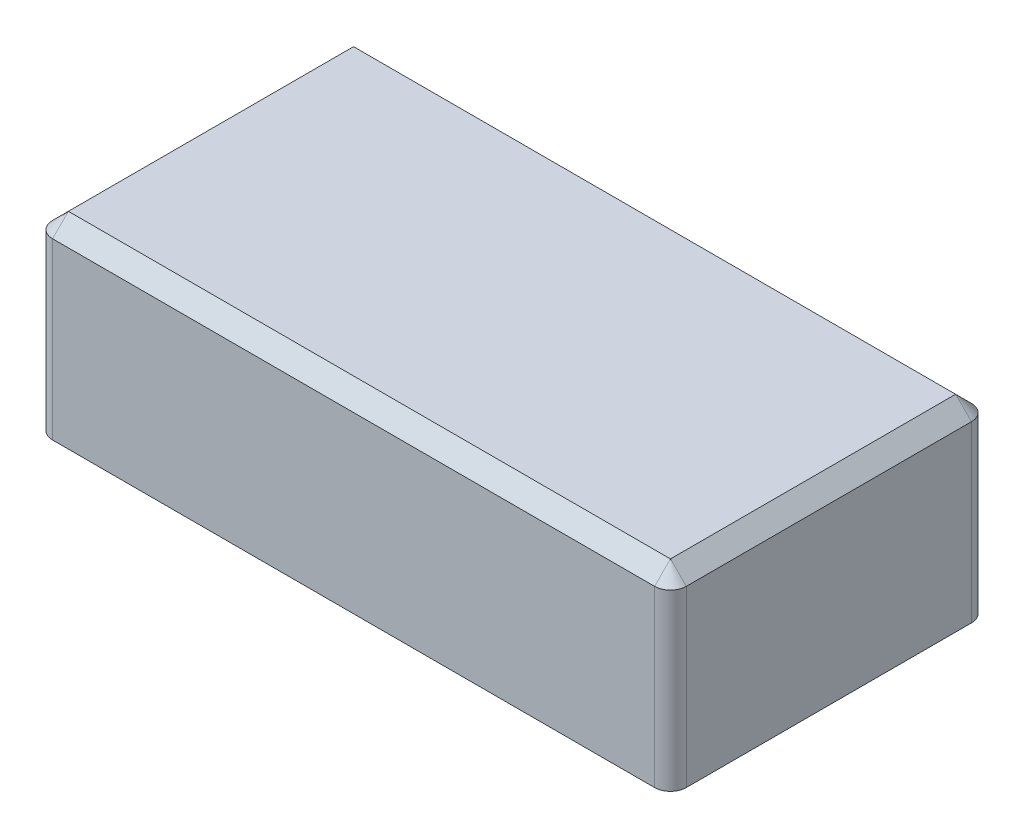
ISO-10303-21;
HEADER;
FILE_DESCRIPTION(('STEP AP214'),'2;1');
FILE_NAME('part.step','',(''),(''),'','','');
FILE_SCHEMA(('AUTOMOTIVE_DESIGN { 1 0 10303 214 1 1 1 1 }'));
ENDSEC;
DATA;
#1=APPLICATION_CONTEXT('core data for automotive mechanical design processes');
#2=APPLICATION_PROTOCOL_DEFINITION('international standard','automotive_design',2000,#1);
#3=PRODUCT_CONTEXT('',#1,'mechanical');
#4=PRODUCT('Part','Part','',(#3));
#5=PRODUCT_RELATED_PRODUCT_CATEGORY('part','',(#4));
#6=PRODUCT_DEFINITION_FORMATION('','',#4);
#7=PRODUCT_DEFINITION_CONTEXT('part definition',#1,'design');
#8=PRODUCT_DEFINITION('design','',#6,#7);
#9=PRODUCT_DEFINITION_SHAPE('','',#8);
#10=(LENGTH_UNIT() NAMED_UNIT(*) SI_UNIT(.MILLI.,.METRE.));
#11=(NAMED_UNIT(*) PLANE_ANGLE_UNIT() SI_UNIT($,.RADIAN.));
#12=(NAMED_UNIT(*) SI_UNIT($,.STERADIAN.) SOLID_ANGLE_UNIT());
#13=UNCERTAINTY_MEASURE_WITH_UNIT(LENGTH_MEASURE(1.E-05),#10,'distance_accuracy_value','');
#14=(GEOMETRIC_REPRESENTATION_CONTEXT(3) GLOBAL_UNCERTAINTY_ASSIGNED_CONTEXT((#13)) GLOBAL_UNIT_ASSIGNED_CONTEXT((#10,
#11,#12)) REPRESENTATION_CONTEXT('',''));
#15=CARTESIAN_POINT('',(0.,0.,0.));
#16=DIRECTION('',(0.,0.,1.));
#17=DIRECTION('',(1.,0.,0.));
#18=AXIS2_PLACEMENT_3D('',#15,#16,#17);
#19=CARTESIAN_POINT('',(0.,0.,100.));
#20=DIRECTION('',(0.,0.,1.));
#21=DIRECTION('',(1.,0.,0.));
#22=AXIS2_PLACEMENT_3D('',#19,#20,#21);
#23=PLANE('',#22);
#24=DIRECTION('',(0.,1.,0.));
#25=VECTOR('',#24,1.);
#26=CARTESIAN_POINT('',(195.,0.,100.));
#27=LINE('',#26,#25);
#28=CARTESIAN_POINT('',(195.,0.,100.));
#29=VERTEX_POINT('',#28);
#30=CARTESIAN_POINT('',(195.,55.,100.));
#31=VERTEX_POINT('',#30);
#32=EDGE_CURVE('E226',#29,#31,#27,.T.);
#33=ORIENTED_EDGE('',*,*,#32,.T.);
#34=DIRECTION('',(-1.,0.,0.));
#35=VECTOR('',#34,1.);
#36=CARTESIAN_POINT('',(0.,55.,100.));
#37=LINE('',#36,#35);
#38=CARTESIAN_POINT('',(5.,55.,100.));
#39=VERTEX_POINT('',#38);
#40=EDGE_CURVE('E241',#31,#39,#37,.T.);
#41=ORIENTED_EDGE('',*,*,#40,.T.);
#42=DIRECTION('',(0.,-1.,0.));
#43=VECTOR('',#42,1.);
#44=CARTESIAN_POINT('',(5.,0.,100.));
#45=LINE('',#44,#43);
#46=CARTESIAN_POINT('',(5.,0.,100.));
#47=VERTEX_POINT('',#46);
#48=EDGE_CURVE('E176',#39,#47,#45,.T.);
#49=ORIENTED_EDGE('',*,*,#48,.T.);
#50=DIRECTION('',(1.,0.,0.));
#51=VECTOR('',#50,1.);
#52=CARTESIAN_POINT('',(0.,0.,100.));
#53=LINE('',#52,#51);
#54=EDGE_CURVE('E186',#47,#29,#53,.T.);
#55=ORIENTED_EDGE('',*,*,#54,.T.);
#56=EDGE_LOOP('',(#33,#41,#49,#55));
#57=FACE_BOUND('',#56,.T.);
#58=ADVANCED_FACE('F86',(#57),#23,.T.);
#59=CARTESIAN_POINT('',(0.,0.,0.));
#60=DIRECTION('',(0.,0.,1.));
#61=DIRECTION('',(1.,0.,0.));
#62=AXIS2_PLACEMENT_3D('',#59,#60,#61);
#63=PLANE('',#62);
#64=DIRECTION('',(0.,-1.,0.));
#65=VECTOR('',#64,1.);
#66=CARTESIAN_POINT('',(5.,60.,0.));
#67=LINE('',#66,#65);
#68=CARTESIAN_POINT('',(5.,0.,0.));
#69=VERTEX_POINT('',#68);
#70=CARTESIAN_POINT('',(5.,55.,0.));
#71=VERTEX_POINT('',#70);
#72=EDGE_CURVE('E190',#69,#71,#67,.F.);
#73=ORIENTED_EDGE('',*,*,#72,.T.);
#74=DIRECTION('',(1.,0.,0.));
#75=VECTOR('',#74,1.);
#76=CARTESIAN_POINT('',(195.,55.,0.));
#77=LINE('',#76,#75);
#78=CARTESIAN_POINT('',(195.,55.,0.));
#79=VERTEX_POINT('',#78);
#80=EDGE_CURVE('E97',#71,#79,#77,.T.);
#81=ORIENTED_EDGE('',*,*,#80,.T.);
#82=DIRECTION('',(0.,1.,0.));
#83=VECTOR('',#82,1.);
#84=CARTESIAN_POINT('',(195.,0.,0.));
#85=LINE('',#84,#83);
#86=CARTESIAN_POINT('',(195.,0.,0.));
#87=VERTEX_POINT('',#86);
#88=EDGE_CURVE('E194',#79,#87,#85,.F.);
#89=ORIENTED_EDGE('',*,*,#88,.T.);
#90=DIRECTION('',(1.,0.,0.));
#91=VECTOR('',#90,1.);
#92=CARTESIAN_POINT('',(0.,0.,0.));
#93=LINE('',#92,#91);
#94=EDGE_CURVE('E174',#69,#87,#93,.T.);
#95=ORIENTED_EDGE('',*,*,#94,.F.);
#96=EDGE_LOOP('',(#73,#81,#89,#95));
#97=FACE_BOUND('',#96,.T.);
#98=ADVANCED_FACE('F312',(#97),#63,.F.);
#99=CARTESIAN_POINT('',(200.,60.,0.));
#100=DIRECTION('',(0.,1.,0.));
#101=DIRECTION('',(0.,0.,1.));
#102=AXIS2_PLACEMENT_3D('',#99,#100,#101);
#103=PLANE('',#102);
#104=DIRECTION('',(0.,0.,1.));
#105=VECTOR('',#104,1.);
#106=CARTESIAN_POINT('',(5.,60.,0.));
#107=LINE('',#106,#105);
#108=CARTESIAN_POINT('',(5.,60.,5.));
#109=VERTEX_POINT('',#108);
#110=CARTESIAN_POINT('',(5.,60.,95.));
#111=VERTEX_POINT('',#110);
#112=EDGE_CURVE('E250',#109,#111,#107,.T.);
#113=ORIENTED_EDGE('',*,*,#112,.T.);
#114=DIRECTION('',(1.,0.,0.));
#115=VECTOR('',#114,1.);
#116=CARTESIAN_POINT('',(200.,60.,95.));
#117=LINE('',#116,#115);
#118=CARTESIAN_POINT('',(195.,60.,95.));
#119=VERTEX_POINT('',#118);
#120=EDGE_CURVE('E253',#111,#119,#117,.T.);
#121=ORIENTED_EDGE('',*,*,#120,.T.);
#122=DIRECTION('',(0.,0.,-1.));
#123=VECTOR('',#122,1.);
#124=CARTESIAN_POINT('',(195.,60.,0.));
#125=LINE('',#124,#123);
#126=CARTESIAN_POINT('',(195.,60.,5.));
#127=VERTEX_POINT('',#126);
#128=EDGE_CURVE('E244',#119,#127,#125,.T.);
#129=ORIENTED_EDGE('',*,*,#128,.T.);
#130=DIRECTION('',(-1.,0.,0.));
#131=VECTOR('',#130,1.);
#132=CARTESIAN_POINT('',(5.,60.,5.));
#133=LINE('',#132,#131);
#134=EDGE_CURVE('E247',#127,#109,#133,.T.);
#135=ORIENTED_EDGE('',*,*,#134,.T.);
#136=EDGE_LOOP('',(#113,#121,#129,#135));
#137=FACE_BOUND('',#136,.T.);
#138=ADVANCED_FACE('F346',(#137),#103,.T.);
#139=CARTESIAN_POINT('',(200.,0.,0.));
#140=DIRECTION('',(1.,0.,0.));
#141=DIRECTION('',(0.,0.,-1.));
#142=AXIS2_PLACEMENT_3D('',#139,#140,#141);
#143=PLANE('',#142);
#144=DIRECTION('',(0.,1.,0.));
#145=VECTOR('',#144,1.);
#146=CARTESIAN_POINT('',(200.,60.,5.));
#147=LINE('',#146,#145);
#148=CARTESIAN_POINT('',(200.,0.,5.));
#149=VERTEX_POINT('',#148);
#150=CARTESIAN_POINT('',(200.,55.,5.));
#151=VERTEX_POINT('',#150);
#152=EDGE_CURVE('E181',#149,#151,#147,.T.);
#153=ORIENTED_EDGE('',*,*,#152,.T.);
#154=DIRECTION('',(0.,0.,1.));
#155=VECTOR('',#154,1.);
#156=CARTESIAN_POINT('',(200.,55.,0.));
#157=LINE('',#156,#155);
#158=CARTESIAN_POINT('',(200.,55.,95.));
#159=VERTEX_POINT('',#158);
#160=EDGE_CURVE('E14',#151,#159,#157,.T.);
#161=ORIENTED_EDGE('',*,*,#160,.T.);
#162=DIRECTION('',(0.,1.,0.));
#163=VECTOR('',#162,1.);
#164=CARTESIAN_POINT('',(200.,0.,95.));
#165=LINE('',#164,#163);
#166=CARTESIAN_POINT('',(200.,0.,95.));
#167=VERTEX_POINT('',#166);
#168=EDGE_CURVE('E184',#159,#167,#165,.F.);
#169=ORIENTED_EDGE('',*,*,#168,.T.);
#170=DIRECTION('',(0.,0.,1.));
#171=VECTOR('',#170,1.);
#172=CARTESIAN_POINT('',(200.,0.,0.));
#173=LINE('',#172,#171);
#174=EDGE_CURVE('E171',#149,#167,#173,.T.);
#175=ORIENTED_EDGE('',*,*,#174,.F.);
#176=EDGE_LOOP('',(#153,#161,#169,#175));
#177=FACE_BOUND('',#176,.T.);
#178=ADVANCED_FACE('F180',(#177),#143,.T.);
#179=CARTESIAN_POINT('',(0.,0.,0.));
#180=DIRECTION('',(0.,-1.,0.));
#181=DIRECTION('',(0.,0.,-1.));
#182=AXIS2_PLACEMENT_3D('',#179,#180,#181);
#183=PLANE('',#182);
#184=ORIENTED_EDGE('',*,*,#94,.T.);
#185=CARTESIAN_POINT('',(195.,0.,5.));
#186=DIRECTION('',(0.,-1.,0.));
#187=DIRECTION('',(0.,0.,-1.));
#188=AXIS2_PLACEMENT_3D('',#185,#186,#187);
#189=CIRCLE('',#188,5.);
#190=EDGE_CURVE('E168',#87,#149,#189,.T.);
#191=ORIENTED_EDGE('',*,*,#190,.T.);
#192=ORIENTED_EDGE('',*,*,#174,.T.);
#193=CARTESIAN_POINT('',(195.,0.,95.));
#194=DIRECTION('',(0.,-1.,0.));
#195=DIRECTION('',(0.,0.,-1.));
#196=AXIS2_PLACEMENT_3D('',#193,#194,#195);
#197=CIRCLE('',#196,5.);
#198=EDGE_CURVE('E177',#167,#29,#197,.T.);
#199=ORIENTED_EDGE('',*,*,#198,.T.);
#200=ORIENTED_EDGE('',*,*,#54,.F.);
#201=CARTESIAN_POINT('',(5.,0.,95.));
#202=DIRECTION('',(0.,-1.,0.));
#203=DIRECTION('',(0.,0.,-1.));
#204=AXIS2_PLACEMENT_3D('',#201,#202,#203);
#205=CIRCLE('',#204,5.);
#206=CARTESIAN_POINT('',(0.,0.,95.));
#207=VERTEX_POINT('',#206);
#208=EDGE_CURVE('E216',#47,#207,#205,.T.);
#209=ORIENTED_EDGE('',*,*,#208,.T.);
#210=DIRECTION('',(0.,0.,1.));
#211=VECTOR('',#210,1.);
#212=CARTESIAN_POINT('',(0.,0.,0.));
#213=LINE('',#212,#211);
#214=CARTESIAN_POINT('',(0.,0.,5.));
#215=VERTEX_POINT('',#214);
#216=EDGE_CURVE('E200',#215,#207,#213,.T.);
#217=ORIENTED_EDGE('',*,*,#216,.F.);
#218=CARTESIAN_POINT('',(5.,0.,5.));
#219=DIRECTION('',(0.,-1.,0.));
#220=DIRECTION('',(0.,0.,-1.));
#221=AXIS2_PLACEMENT_3D('',#218,#219,#220);
#222=CIRCLE('',#221,5.);
#223=EDGE_CURVE('E219',#215,#69,#222,.T.);
#224=ORIENTED_EDGE('',*,*,#223,.T.);
#225=EDGE_LOOP('',(#184,#191,#192,#199,#200,#209,#217,#224));
#226=FACE_BOUND('',#225,.T.);
#227=ADVANCED_FACE('F170',(#226),#183,.T.);
#228=CARTESIAN_POINT('',(0.,60.,0.));
#229=DIRECTION('',(-1.,0.,0.));
#230=DIRECTION('',(0.,0.,1.));
#231=AXIS2_PLACEMENT_3D('',#228,#229,#230);
#232=PLANE('',#231);
#233=DIRECTION('',(0.,-1.,0.));
#234=VECTOR('',#233,1.);
#235=CARTESIAN_POINT('',(0.,60.,95.));
#236=LINE('',#235,#234);
#237=CARTESIAN_POINT('',(0.,55.,95.));
#238=VERTEX_POINT('',#237);
#239=EDGE_CURVE('E230',#207,#238,#236,.F.);
#240=ORIENTED_EDGE('',*,*,#239,.T.);
#241=DIRECTION('',(0.,0.,-1.));
#242=VECTOR('',#241,1.);
#243=CARTESIAN_POINT('',(0.,55.,0.));
#244=LINE('',#243,#242);
#245=CARTESIAN_POINT('',(0.,55.,5.));
#246=VERTEX_POINT('',#245);
#247=EDGE_CURVE('E260',#238,#246,#244,.T.);
#248=ORIENTED_EDGE('',*,*,#247,.T.);
#249=DIRECTION('',(0.,-1.,0.));
#250=VECTOR('',#249,1.);
#251=CARTESIAN_POINT('',(0.,0.,5.));
#252=LINE('',#251,#250);
#253=EDGE_CURVE('E234',#246,#215,#252,.T.);
#254=ORIENTED_EDGE('',*,*,#253,.T.);
#255=ORIENTED_EDGE('',*,*,#216,.T.);
#256=EDGE_LOOP('',(#240,#248,#254,#255));
#257=FACE_BOUND('',#256,.T.);
#258=ADVANCED_FACE('F355',(#257),#232,.T.);
#259=CARTESIAN_POINT('',(195.,0.,5.));
#260=DIRECTION('',(0.,-1.,0.));
#261=DIRECTION('',(0.,0.,-1.));
#262=AXIS2_PLACEMENT_3D('',#259,#260,#261);
#263=CYLINDRICAL_SURFACE('',#262,5.);
#264=ORIENTED_EDGE('',*,*,#88,.F.);
#265=CARTESIAN_POINT('',(195.,55.,5.));
#266=DIRECTION('',(0.,1.,0.));
#267=DIRECTION('',(0.,0.,1.));
#268=AXIS2_PLACEMENT_3D('',#265,#266,#267);
#269=CIRCLE('',#268,5.);
#270=EDGE_CURVE('E105',#79,#151,#269,.F.);
#271=ORIENTED_EDGE('',*,*,#270,.T.);
#272=ORIENTED_EDGE('',*,*,#152,.F.);
#273=ORIENTED_EDGE('',*,*,#190,.F.);
#274=EDGE_LOOP('',(#264,#271,#272,#273));
#275=FACE_BOUND('',#274,.T.);
#276=ADVANCED_FACE('F188',(#275),#263,.T.);
#277=CARTESIAN_POINT('',(195.,0.,95.));
#278=DIRECTION('',(0.,1.,0.));
#279=DIRECTION('',(0.,0.,1.));
#280=AXIS2_PLACEMENT_3D('',#277,#278,#279);
#281=CYLINDRICAL_SURFACE('',#280,5.);
#282=ORIENTED_EDGE('',*,*,#168,.F.);
#283=CARTESIAN_POINT('',(195.,55.,95.));
#284=DIRECTION('',(0.,1.,0.));
#285=DIRECTION('',(0.,0.,1.));
#286=AXIS2_PLACEMENT_3D('',#283,#284,#285);
#287=CIRCLE('',#286,5.);
#288=EDGE_CURVE('E237',#159,#31,#287,.F.);
#289=ORIENTED_EDGE('',*,*,#288,.T.);
#290=ORIENTED_EDGE('',*,*,#32,.F.);
#291=ORIENTED_EDGE('',*,*,#198,.F.);
#292=EDGE_LOOP('',(#282,#289,#290,#291));
#293=FACE_BOUND('',#292,.T.);
#294=ADVANCED_FACE('F325',(#293),#281,.T.);
#295=CARTESIAN_POINT('',(5.,60.,5.));
#296=DIRECTION('',(0.,1.,0.));
#297=DIRECTION('',(0.,0.,1.));
#298=AXIS2_PLACEMENT_3D('',#295,#296,#297);
#299=CYLINDRICAL_SURFACE('',#298,5.);
#300=ORIENTED_EDGE('',*,*,#253,.F.);
#301=CARTESIAN_POINT('',(5.,55.,5.));
#302=DIRECTION('',(0.,1.,0.));
#303=DIRECTION('',(0.,0.,1.));
#304=AXIS2_PLACEMENT_3D('',#301,#302,#303);
#305=CIRCLE('',#304,5.);
#306=EDGE_CURVE('E263',#246,#71,#305,.F.);
#307=ORIENTED_EDGE('',*,*,#306,.T.);
#308=ORIENTED_EDGE('',*,*,#72,.F.);
#309=ORIENTED_EDGE('',*,*,#223,.F.);
#310=EDGE_LOOP('',(#300,#307,#308,#309));
#311=FACE_BOUND('',#310,.T.);
#312=ADVANCED_FACE('F310',(#311),#299,.T.);
#313=CARTESIAN_POINT('',(5.,0.,95.));
#314=DIRECTION('',(0.,-1.,0.));
#315=DIRECTION('',(0.,0.,-1.));
#316=AXIS2_PLACEMENT_3D('',#313,#314,#315);
#317=CYLINDRICAL_SURFACE('',#316,5.);
#318=ORIENTED_EDGE('',*,*,#48,.F.);
#319=CARTESIAN_POINT('',(5.,55.,95.));
#320=DIRECTION('',(0.,1.,0.));
#321=DIRECTION('',(0.,0.,1.));
#322=AXIS2_PLACEMENT_3D('',#319,#320,#321);
#323=CIRCLE('',#322,5.);
#324=EDGE_CURVE('E257',#39,#238,#323,.F.);
#325=ORIENTED_EDGE('',*,*,#324,.T.);
#326=ORIENTED_EDGE('',*,*,#239,.F.);
#327=ORIENTED_EDGE('',*,*,#208,.F.);
#328=EDGE_LOOP('',(#318,#325,#326,#327));
#329=FACE_BOUND('',#328,.T.);
#330=ADVANCED_FACE('F340',(#329),#317,.T.);
#331=CARTESIAN_POINT('',(5.,55.,5.));
#332=DIRECTION('',(0.,-1.,0.));
#333=DIRECTION('',(0.,0.,-1.));
#334=AXIS2_PLACEMENT_3D('',#331,#332,#333);
#335=CONICAL_SURFACE('',#334,5.,0.785398163397449);
#336=DIRECTION('',(0.,0.707106781186547,0.707106781186548));
#337=VECTOR('',#336,1.);
#338=CARTESIAN_POINT('',(5.,55.,0.));
#339=LINE('',#338,#337);
#340=EDGE_CURVE('E291',#71,#109,#339,.T.);
#341=ORIENTED_EDGE('',*,*,#340,.F.);
#342=ORIENTED_EDGE('',*,*,#306,.F.);
#343=DIRECTION('',(-0.707106781186548,-0.707106781186547,0.));
#344=VECTOR('',#343,1.);
#345=CARTESIAN_POINT('',(5.,60.,5.));
#346=LINE('',#345,#344);
#347=EDGE_CURVE('E91',#109,#246,#346,.T.);
#348=ORIENTED_EDGE('',*,*,#347,.F.);
#349=EDGE_LOOP('',(#341,#342,#348));
#350=FACE_BOUND('',#349,.T.);
#351=ADVANCED_FACE('F89',(#350),#335,.T.);
#352=CARTESIAN_POINT('',(5.,60.,0.));
#353=DIRECTION('',(0.707106781186547,-0.707106781186548,0.));
#354=DIRECTION('',(0.,0.,1.));
#355=AXIS2_PLACEMENT_3D('',#352,#353,#354);
#356=PLANE('',#355);
#357=ORIENTED_EDGE('',*,*,#347,.T.);
#358=ORIENTED_EDGE('',*,*,#247,.F.);
#359=DIRECTION('',(-0.707106781186548,-0.707106781186547,0.));
#360=VECTOR('',#359,1.);
#361=CARTESIAN_POINT('',(5.,60.,95.));
#362=LINE('',#361,#360);
#363=EDGE_CURVE('E288',#111,#238,#362,.T.);
#364=ORIENTED_EDGE('',*,*,#363,.F.);
#365=ORIENTED_EDGE('',*,*,#112,.F.);
#366=EDGE_LOOP('',(#357,#358,#364,#365));
#367=FACE_BOUND('',#366,.T.);
#368=ADVANCED_FACE('F303',(#367),#356,.F.);
#369=CARTESIAN_POINT('',(200.,60.,5.));
#370=DIRECTION('',(0.,0.707106781186548,-0.707106781186547));
#371=DIRECTION('',(1.,0.,0.));
#372=AXIS2_PLACEMENT_3D('',#369,#370,#371);
#373=PLANE('',#372);
#374=ORIENTED_EDGE('',*,*,#340,.T.);
#375=ORIENTED_EDGE('',*,*,#134,.F.);
#376=DIRECTION('',(0.,0.707106781186547,0.707106781186548));
#377=VECTOR('',#376,1.);
#378=CARTESIAN_POINT('',(195.,55.,0.));
#379=LINE('',#378,#377);
#380=EDGE_CURVE('E284',#79,#127,#379,.T.);
#381=ORIENTED_EDGE('',*,*,#380,.F.);
#382=ORIENTED_EDGE('',*,*,#80,.F.);
#383=EDGE_LOOP('',(#374,#375,#381,#382));
#384=FACE_BOUND('',#383,.T.);
#385=ADVANCED_FACE('F315',(#384),#373,.T.);
#386=CARTESIAN_POINT('',(5.,55.,95.));
#387=DIRECTION('',(0.,-1.,0.));
#388=DIRECTION('',(0.,0.,-1.));
#389=AXIS2_PLACEMENT_3D('',#386,#387,#388);
#390=CONICAL_SURFACE('',#389,5.,0.785398163397449);
#391=ORIENTED_EDGE('',*,*,#363,.T.);
#392=ORIENTED_EDGE('',*,*,#324,.F.);
#393=DIRECTION('',(0.,-0.707106781186547,0.707106781186548));
#394=VECTOR('',#393,1.);
#395=CARTESIAN_POINT('',(5.,60.,95.));
#396=LINE('',#395,#394);
#397=EDGE_CURVE('E280',#111,#39,#396,.T.);
#398=ORIENTED_EDGE('',*,*,#397,.F.);
#399=EDGE_LOOP('',(#391,#392,#398));
#400=FACE_BOUND('',#399,.T.);
#401=ADVANCED_FACE('F344',(#400),#390,.T.);
#402=CARTESIAN_POINT('',(195.,55.,5.));
#403=DIRECTION('',(0.,-1.,0.));
#404=DIRECTION('',(0.,0.,-1.));
#405=AXIS2_PLACEMENT_3D('',#402,#403,#404);
#406=CONICAL_SURFACE('',#405,5.,0.785398163397449);
#407=ORIENTED_EDGE('',*,*,#270,.F.);
#408=ORIENTED_EDGE('',*,*,#380,.T.);
#409=DIRECTION('',(-0.707106781186548,0.707106781186547,0.));
#410=VECTOR('',#409,1.);
#411=CARTESIAN_POINT('',(200.,55.,5.));
#412=LINE('',#411,#410);
#413=EDGE_CURVE('E276',#151,#127,#412,.T.);
#414=ORIENTED_EDGE('',*,*,#413,.F.);
#415=EDGE_LOOP('',(#407,#408,#414));
#416=FACE_BOUND('',#415,.T.);
#417=ADVANCED_FACE('F317',(#416),#406,.T.);
#418=CARTESIAN_POINT('',(0.,55.,100.));
#419=DIRECTION('',(0.,-0.707106781186548,-0.707106781186547));
#420=DIRECTION('',(-1.,0.,0.));
#421=AXIS2_PLACEMENT_3D('',#418,#419,#420);
#422=PLANE('',#421);
#423=ORIENTED_EDGE('',*,*,#397,.T.);
#424=ORIENTED_EDGE('',*,*,#40,.F.);
#425=DIRECTION('',(0.,-0.707106781186547,0.707106781186548));
#426=VECTOR('',#425,1.);
#427=CARTESIAN_POINT('',(195.,60.,95.));
#428=LINE('',#427,#426);
#429=EDGE_CURVE('E273',#119,#31,#428,.T.);
#430=ORIENTED_EDGE('',*,*,#429,.F.);
#431=ORIENTED_EDGE('',*,*,#120,.F.);
#432=EDGE_LOOP('',(#423,#424,#430,#431));
#433=FACE_BOUND('',#432,.T.);
#434=ADVANCED_FACE('F333',(#433),#422,.F.);
#435=CARTESIAN_POINT('',(200.,55.,0.));
#436=DIRECTION('',(-0.707106781186547,-0.707106781186548,0.));
#437=DIRECTION('',(0.,0.,1.));
#438=AXIS2_PLACEMENT_3D('',#435,#436,#437);
#439=PLANE('',#438);
#440=ORIENTED_EDGE('',*,*,#413,.T.);
#441=ORIENTED_EDGE('',*,*,#128,.F.);
#442=DIRECTION('',(-0.707106781186548,0.707106781186547,0.));
#443=VECTOR('',#442,1.);
#444=CARTESIAN_POINT('',(200.,55.,95.));
#445=LINE('',#444,#443);
#446=EDGE_CURVE('E270',#159,#119,#445,.T.);
#447=ORIENTED_EDGE('',*,*,#446,.F.);
#448=ORIENTED_EDGE('',*,*,#160,.F.);
#449=EDGE_LOOP('',(#440,#441,#447,#448));
#450=FACE_BOUND('',#449,.T.);
#451=ADVANCED_FACE('F322',(#450),#439,.F.);
#452=CARTESIAN_POINT('',(195.,55.,95.));
#453=DIRECTION('',(0.,-1.,0.));
#454=DIRECTION('',(0.,0.,-1.));
#455=AXIS2_PLACEMENT_3D('',#452,#453,#454);
#456=CONICAL_SURFACE('',#455,5.,0.785398163397449);
#457=ORIENTED_EDGE('',*,*,#429,.T.);
#458=ORIENTED_EDGE('',*,*,#288,.F.);
#459=ORIENTED_EDGE('',*,*,#446,.T.);
#460=EDGE_LOOP('',(#457,#458,#459));
#461=FACE_BOUND('',#460,.T.);
#462=ADVANCED_FACE('F328',(#461),#456,.T.);
#463=CLOSED_SHELL('',(#58,#98,#138,#178,#227,#258,#276,#294,#312,#330,#351,#368,#385,#401,#417,
#434,#451,#462));
#464=MANIFOLD_SOLID_BREP('B2',#463);
#465=ADVANCED_BREP_SHAPE_REPRESENTATION('',(#18,#464),#14);
#466=SHAPE_DEFINITION_REPRESENTATION(#9,#465);
ENDSEC;
END-ISO-10303-21;
